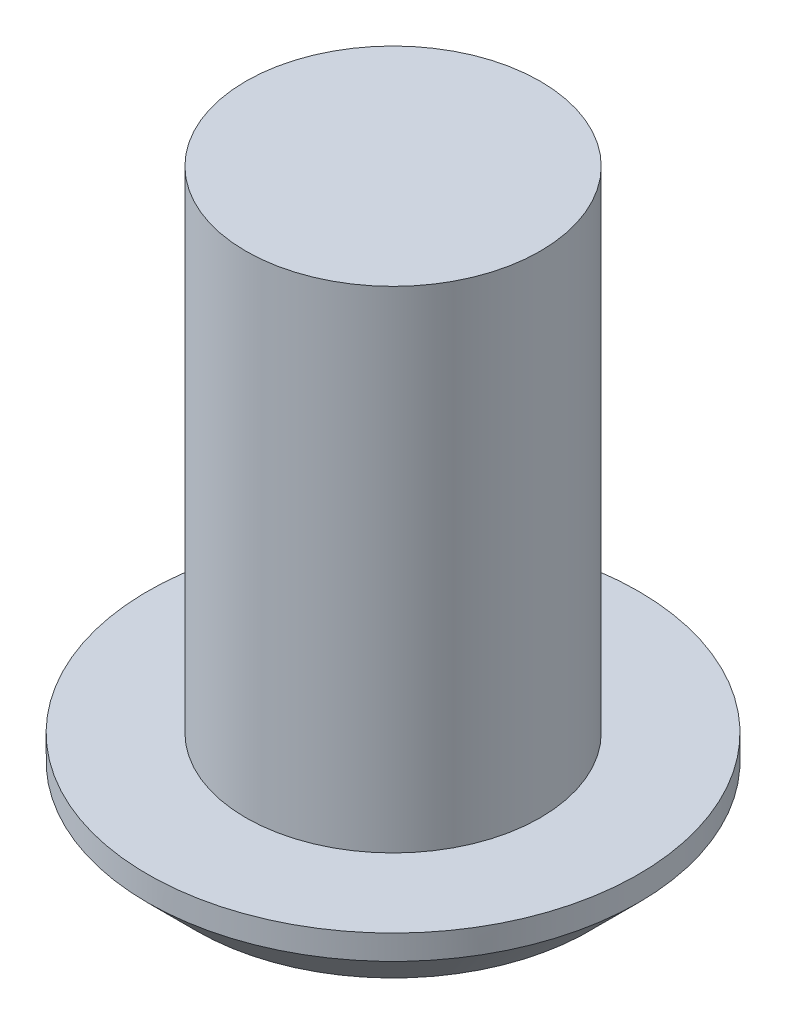
ISO-10303-21;
HEADER;
FILE_DESCRIPTION(('STEP AP214'),'2;1');
FILE_NAME('part.step','',(''),(''),'','','');
FILE_SCHEMA(('AUTOMOTIVE_DESIGN { 1 0 10303 214 1 1 1 1 }'));
ENDSEC;
DATA;
#1=APPLICATION_CONTEXT('core data for automotive mechanical design processes');
#2=APPLICATION_PROTOCOL_DEFINITION('international standard','automotive_design',2000,#1);
#3=PRODUCT_CONTEXT('',#1,'mechanical');
#4=PRODUCT('Part','Part','',(#3));
#5=PRODUCT_RELATED_PRODUCT_CATEGORY('part','',(#4));
#6=PRODUCT_DEFINITION_FORMATION('','',#4);
#7=PRODUCT_DEFINITION_CONTEXT('part definition',#1,'design');
#8=PRODUCT_DEFINITION('design','',#6,#7);
#9=PRODUCT_DEFINITION_SHAPE('','',#8);
#10=(LENGTH_UNIT() NAMED_UNIT(*) SI_UNIT(.MILLI.,.METRE.));
#11=(NAMED_UNIT(*) PLANE_ANGLE_UNIT() SI_UNIT($,.RADIAN.));
#12=(NAMED_UNIT(*) SI_UNIT($,.STERADIAN.) SOLID_ANGLE_UNIT());
#13=UNCERTAINTY_MEASURE_WITH_UNIT(LENGTH_MEASURE(1.E-05),#10,'distance_accuracy_value','');
#14=(GEOMETRIC_REPRESENTATION_CONTEXT(3) GLOBAL_UNCERTAINTY_ASSIGNED_CONTEXT((#13)) GLOBAL_UNIT_ASSIGNED_CONTEXT((#10,
#11,#12)) REPRESENTATION_CONTEXT('',''));
#15=CARTESIAN_POINT('',(0.,0.,0.));
#16=DIRECTION('',(0.,0.,1.));
#17=DIRECTION('',(1.,0.,0.));
#18=AXIS2_PLACEMENT_3D('',#15,#16,#17);
#19=CARTESIAN_POINT('',(0.,-1.5,0.));
#20=DIRECTION('',(0.,1.,0.));
#21=DIRECTION('',(0.,0.,1.));
#22=AXIS2_PLACEMENT_3D('',#19,#20,#21);
#23=PLANE('',#22);
#24=CARTESIAN_POINT('',(0.,-1.5,0.));
#25=DIRECTION('',(0.,1.,0.));
#26=DIRECTION('',(0.,0.,1.));
#27=AXIS2_PLACEMENT_3D('',#24,#25,#26);
#28=CIRCLE('',#27,4.);
#29=CARTESIAN_POINT('',(0.,-1.5,4.));
#30=VERTEX_POINT('',#29);
#31=EDGE_CURVE('E47',#30,#30,#28,.F.);
#32=ORIENTED_EDGE('',*,*,#31,.T.);
#33=EDGE_LOOP('',(#32));
#34=FACE_BOUND('',#33,.T.);
#35=ADVANCED_FACE('F41',(#34),#23,.F.);
#36=CARTESIAN_POINT('',(0.,10.,0.));
#37=DIRECTION('',(0.,-1.,0.));
#38=DIRECTION('',(0.,0.,-1.));
#39=AXIS2_PLACEMENT_3D('',#36,#37,#38);
#40=PLANE('',#39);
#41=CARTESIAN_POINT('',(0.,10.,0.));
#42=DIRECTION('',(0.,-1.,0.));
#43=DIRECTION('',(0.,0.,-1.));
#44=AXIS2_PLACEMENT_3D('',#41,#42,#43);
#45=CIRCLE('',#44,3.);
#46=CARTESIAN_POINT('',(0.,10.,-3.));
#47=VERTEX_POINT('',#46);
#48=EDGE_CURVE('E52',#47,#47,#45,.T.);
#49=ORIENTED_EDGE('',*,*,#48,.F.);
#50=EDGE_LOOP('',(#49));
#51=FACE_BOUND('',#50,.T.);
#52=ADVANCED_FACE('F76',(#51),#40,.F.);
#53=CARTESIAN_POINT('',(0.,-2.30142689392592,0.));
#54=DIRECTION('',(0.,-1.,0.));
#55=DIRECTION('',(0.,0.,-1.));
#56=AXIS2_PLACEMENT_3D('',#53,#54,#55);
#57=CYLINDRICAL_SURFACE('',#56,3.);
#58=CARTESIAN_POINT('',(0.,0.,0.));
#59=DIRECTION('',(0.,-1.,0.));
#60=DIRECTION('',(0.,0.,-1.));
#61=AXIS2_PLACEMENT_3D('',#58,#59,#60);
#62=CIRCLE('',#61,3.);
#63=CARTESIAN_POINT('',(0.,0.,-3.));
#64=VERTEX_POINT('',#63);
#65=EDGE_CURVE('E60',#64,#64,#62,.T.);
#66=ORIENTED_EDGE('',*,*,#65,.F.);
#67=EDGE_LOOP('',(#66));
#68=FACE_BOUND('',#67,.T.);
#69=ORIENTED_EDGE('',*,*,#48,.T.);
#70=EDGE_LOOP('',(#69));
#71=FACE_BOUND('',#70,.T.);
#72=ADVANCED_FACE('F67',(#68,#71),#57,.T.);
#73=CARTESIAN_POINT('',(0.,0.,0.));
#74=DIRECTION('',(0.,1.,0.));
#75=DIRECTION('',(0.,0.,1.));
#76=AXIS2_PLACEMENT_3D('',#73,#74,#75);
#77=PLANE('',#76);
#78=ORIENTED_EDGE('',*,*,#65,.T.);
#79=EDGE_LOOP('',(#78));
#80=FACE_BOUND('',#79,.T.);
#81=CARTESIAN_POINT('',(0.,0.,0.));
#82=DIRECTION('',(0.,-1.,0.));
#83=DIRECTION('',(0.,0.,-1.));
#84=AXIS2_PLACEMENT_3D('',#81,#82,#83);
#85=CIRCLE('',#84,5.);
#86=CARTESIAN_POINT('',(0.,0.,-5.));
#87=VERTEX_POINT('',#86);
#88=EDGE_CURVE('E65',#87,#87,#85,.T.);
#89=ORIENTED_EDGE('',*,*,#88,.F.);
#90=EDGE_LOOP('',(#89));
#91=FACE_BOUND('',#90,.T.);
#92=ADVANCED_FACE('F70',(#80,#91),#77,.T.);
#93=CARTESIAN_POINT('',(0.,-2.30142689392592,0.));
#94=DIRECTION('',(0.,-1.,0.));
#95=DIRECTION('',(0.,0.,-1.));
#96=AXIS2_PLACEMENT_3D('',#93,#94,#95);
#97=CYLINDRICAL_SURFACE('',#96,5.);
#98=CARTESIAN_POINT('',(0.,-0.499999999999999,0.));
#99=DIRECTION('',(0.,1.,0.));
#100=DIRECTION('',(0.,0.,1.));
#101=AXIS2_PLACEMENT_3D('',#98,#99,#100);
#102=CIRCLE('',#101,5.);
#103=CARTESIAN_POINT('',(0.,-0.499999999999999,5.));
#104=VERTEX_POINT('',#103);
#105=EDGE_CURVE('E10',#104,#104,#102,.T.);
#106=ORIENTED_EDGE('',*,*,#105,.T.);
#107=EDGE_LOOP('',(#106));
#108=FACE_BOUND('',#107,.T.);
#109=ORIENTED_EDGE('',*,*,#88,.T.);
#110=EDGE_LOOP('',(#109));
#111=FACE_BOUND('',#110,.T.);
#112=ADVANCED_FACE('F69',(#108,#111),#97,.T.);
#113=CARTESIAN_POINT('',(0.,-1.5,0.));
#114=DIRECTION('',(0.,1.,0.));
#115=DIRECTION('',(0.,0.,1.));
#116=AXIS2_PLACEMENT_3D('',#113,#114,#115);
#117=CONICAL_SURFACE('',#116,4.,0.785398163397447);
#118=ORIENTED_EDGE('',*,*,#105,.F.);
#119=EDGE_LOOP('',(#118));
#120=FACE_BOUND('',#119,.T.);
#121=ORIENTED_EDGE('',*,*,#31,.F.);
#122=EDGE_LOOP('',(#121));
#123=FACE_BOUND('',#122,.T.);
#124=ADVANCED_FACE('F42',(#120,#123),#117,.T.);
#125=CLOSED_SHELL('',(#35,#52,#72,#92,#112,#124));
#126=MANIFOLD_SOLID_BREP('B2',#125);
#127=ADVANCED_BREP_SHAPE_REPRESENTATION('',(#18,#126),#14);
#128=SHAPE_DEFINITION_REPRESENTATION(#9,#127);
ENDSEC;
END-ISO-10303-21;
